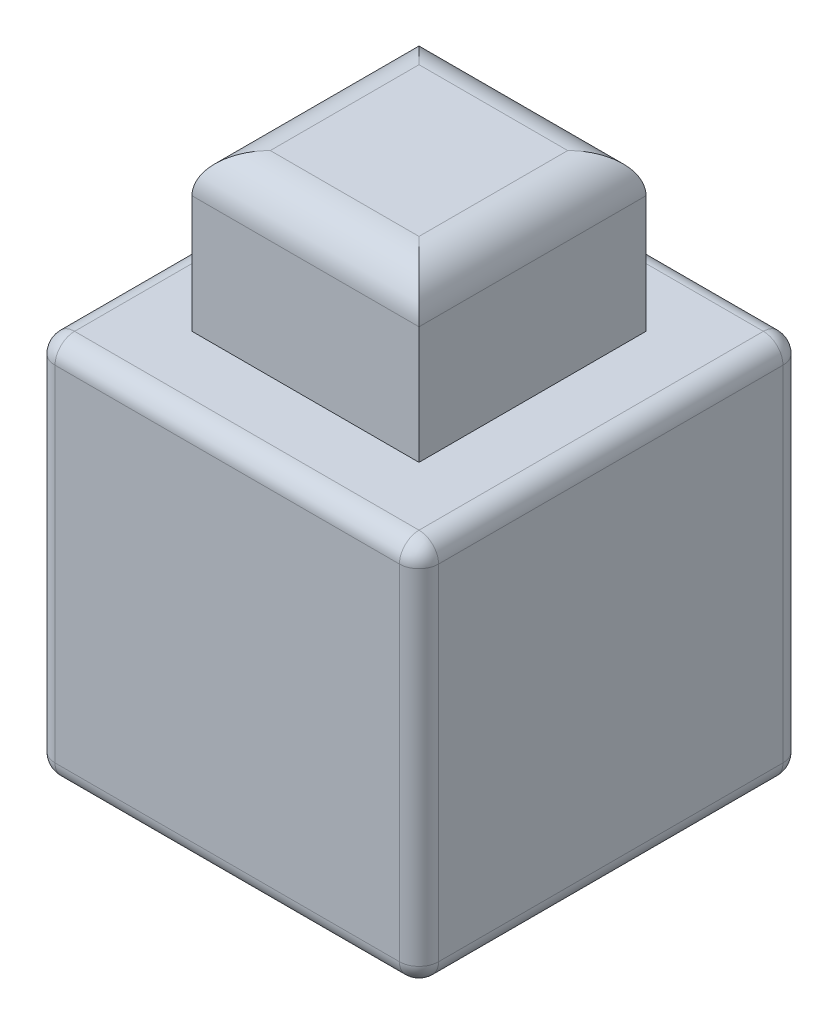
ISO-10303-21;
HEADER;
FILE_DESCRIPTION(('STEP AP214'),'2;1');
FILE_NAME('part.step','',(''),(''),'','','');
FILE_SCHEMA(('AUTOMOTIVE_DESIGN { 1 0 10303 214 1 1 1 1 }'));
ENDSEC;
DATA;
#1=APPLICATION_CONTEXT('core data for automotive mechanical design processes');
#2=APPLICATION_PROTOCOL_DEFINITION('international standard','automotive_design',2000,#1);
#3=PRODUCT_CONTEXT('',#1,'mechanical');
#4=PRODUCT('Part','Part','',(#3));
#5=PRODUCT_RELATED_PRODUCT_CATEGORY('part','',(#4));
#6=PRODUCT_DEFINITION_FORMATION('','',#4);
#7=PRODUCT_DEFINITION_CONTEXT('part definition',#1,'design');
#8=PRODUCT_DEFINITION('design','',#6,#7);
#9=PRODUCT_DEFINITION_SHAPE('','',#8);
#10=(LENGTH_UNIT() NAMED_UNIT(*) SI_UNIT(.MILLI.,.METRE.));
#11=(NAMED_UNIT(*) PLANE_ANGLE_UNIT() SI_UNIT($,.RADIAN.));
#12=(NAMED_UNIT(*) SI_UNIT($,.STERADIAN.) SOLID_ANGLE_UNIT());
#13=UNCERTAINTY_MEASURE_WITH_UNIT(LENGTH_MEASURE(1.E-05),#10,'distance_accuracy_value','');
#14=(GEOMETRIC_REPRESENTATION_CONTEXT(3) GLOBAL_UNCERTAINTY_ASSIGNED_CONTEXT((#13)) GLOBAL_UNIT_ASSIGNED_CONTEXT((#10,
#11,#12)) REPRESENTATION_CONTEXT('',''));
#15=CARTESIAN_POINT('',(0.,0.,0.));
#16=DIRECTION('',(0.,0.,1.));
#17=DIRECTION('',(1.,0.,0.));
#18=AXIS2_PLACEMENT_3D('',#15,#16,#17);
#19=CARTESIAN_POINT('',(4.9,4.9,-9.8));
#20=DIRECTION('',(1.,0.,0.));
#21=DIRECTION('',(0.,1.,0.));
#22=AXIS2_PLACEMENT_3D('',#19,#20,#21);
#23=PLANE('',#22);
#24=DIRECTION('',(0.,1.,0.));
#25=VECTOR('',#24,1.);
#26=CARTESIAN_POINT('',(4.9,4.9,-9.3));
#27=LINE('',#26,#25);
#28=CARTESIAN_POINT('',(4.9,-4.4,-9.3));
#29=VERTEX_POINT('',#28);
#30=CARTESIAN_POINT('',(4.9,4.4,-9.3));
#31=VERTEX_POINT('',#30);
#32=EDGE_CURVE('E290',#29,#31,#27,.T.);
#33=ORIENTED_EDGE('',*,*,#32,.T.);
#34=DIRECTION('',(0.,0.,1.));
#35=VECTOR('',#34,1.);
#36=CARTESIAN_POINT('',(4.9,4.4,-9.8));
#37=LINE('',#36,#35);
#38=CARTESIAN_POINT('',(4.9,4.4,-0.5));
#39=VERTEX_POINT('',#38);
#40=EDGE_CURVE('E293',#31,#39,#37,.T.);
#41=ORIENTED_EDGE('',*,*,#40,.T.);
#42=DIRECTION('',(0.,1.,0.));
#43=VECTOR('',#42,1.);
#44=CARTESIAN_POINT('',(4.9,4.9,-0.5));
#45=LINE('',#44,#43);
#46=CARTESIAN_POINT('',(4.9,-4.4,-0.5));
#47=VERTEX_POINT('',#46);
#48=EDGE_CURVE('E287',#39,#47,#45,.F.);
#49=ORIENTED_EDGE('',*,*,#48,.T.);
#50=DIRECTION('',(0.,0.,1.));
#51=VECTOR('',#50,1.);
#52=CARTESIAN_POINT('',(4.9,-4.4,-9.8));
#53=LINE('',#52,#51);
#54=EDGE_CURVE('E284',#47,#29,#53,.F.);
#55=ORIENTED_EDGE('',*,*,#54,.T.);
#56=EDGE_LOOP('',(#33,#41,#49,#55));
#57=FACE_BOUND('',#56,.T.);
#58=ADVANCED_FACE('F39',(#57),#23,.T.);
#59=CARTESIAN_POINT('',(-4.9,-4.9,-9.8));
#60=DIRECTION('',(0.,-1.,0.));
#61=DIRECTION('',(0.,0.,-1.));
#62=AXIS2_PLACEMENT_3D('',#59,#60,#61);
#63=PLANE('',#62);
#64=DIRECTION('',(1.,0.,0.));
#65=VECTOR('',#64,1.);
#66=CARTESIAN_POINT('',(4.9,-4.9,-9.3));
#67=LINE('',#66,#65);
#68=CARTESIAN_POINT('',(-4.4,-4.9,-9.3));
#69=VERTEX_POINT('',#68);
#70=CARTESIAN_POINT('',(4.4,-4.9,-9.3));
#71=VERTEX_POINT('',#70);
#72=EDGE_CURVE('E49',#69,#71,#67,.T.);
#73=ORIENTED_EDGE('',*,*,#72,.T.);
#74=DIRECTION('',(0.,0.,1.));
#75=VECTOR('',#74,1.);
#76=CARTESIAN_POINT('',(4.4,-4.9,-9.8));
#77=LINE('',#76,#75);
#78=CARTESIAN_POINT('',(4.4,-4.9,-0.5));
#79=VERTEX_POINT('',#78);
#80=EDGE_CURVE('E11',#71,#79,#77,.T.);
#81=ORIENTED_EDGE('',*,*,#80,.T.);
#82=DIRECTION('',(1.,0.,0.));
#83=VECTOR('',#82,1.);
#84=CARTESIAN_POINT('',(-4.9,-4.9,-0.5));
#85=LINE('',#84,#83);
#86=CARTESIAN_POINT('',(-4.4,-4.9,-0.5));
#87=VERTEX_POINT('',#86);
#88=EDGE_CURVE('E310',#79,#87,#85,.F.);
#89=ORIENTED_EDGE('',*,*,#88,.T.);
#90=DIRECTION('',(0.,0.,1.));
#91=VECTOR('',#90,1.);
#92=CARTESIAN_POINT('',(-4.4,-4.9,-9.8));
#93=LINE('',#92,#91);
#94=EDGE_CURVE('E60',#87,#69,#93,.F.);
#95=ORIENTED_EDGE('',*,*,#94,.T.);
#96=EDGE_LOOP('',(#73,#81,#89,#95));
#97=FACE_BOUND('',#96,.T.);
#98=ADVANCED_FACE('F445',(#97),#63,.T.);
#99=CARTESIAN_POINT('',(-4.9,4.9,-9.8));
#100=DIRECTION('',(-1.,0.,0.));
#101=DIRECTION('',(0.,0.,1.));
#102=AXIS2_PLACEMENT_3D('',#99,#100,#101);
#103=PLANE('',#102);
#104=DIRECTION('',(0.,-1.,0.));
#105=VECTOR('',#104,1.);
#106=CARTESIAN_POINT('',(-4.9,4.9,-0.5));
#107=LINE('',#106,#105);
#108=CARTESIAN_POINT('',(-4.9,-4.4,-0.5));
#109=VERTEX_POINT('',#108);
#110=CARTESIAN_POINT('',(-4.9,4.4,-0.5));
#111=VERTEX_POINT('',#110);
#112=EDGE_CURVE('E261',#109,#111,#107,.F.);
#113=ORIENTED_EDGE('',*,*,#112,.T.);
#114=DIRECTION('',(0.,0.,1.));
#115=VECTOR('',#114,1.);
#116=CARTESIAN_POINT('',(-4.9,4.4,-9.8));
#117=LINE('',#116,#115);
#118=CARTESIAN_POINT('',(-4.9,4.4,-9.3));
#119=VERTEX_POINT('',#118);
#120=EDGE_CURVE('E267',#111,#119,#117,.F.);
#121=ORIENTED_EDGE('',*,*,#120,.T.);
#122=DIRECTION('',(0.,-1.,0.));
#123=VECTOR('',#122,1.);
#124=CARTESIAN_POINT('',(-4.9,-4.9,-9.3));
#125=LINE('',#124,#123);
#126=CARTESIAN_POINT('',(-4.9,-4.4,-9.3));
#127=VERTEX_POINT('',#126);
#128=EDGE_CURVE('E264',#119,#127,#125,.T.);
#129=ORIENTED_EDGE('',*,*,#128,.T.);
#130=DIRECTION('',(0.,0.,1.));
#131=VECTOR('',#130,1.);
#132=CARTESIAN_POINT('',(-4.9,-4.4,-9.8));
#133=LINE('',#132,#131);
#134=EDGE_CURVE('E258',#127,#109,#133,.T.);
#135=ORIENTED_EDGE('',*,*,#134,.T.);
#136=EDGE_LOOP('',(#113,#121,#129,#135));
#137=FACE_BOUND('',#136,.T.);
#138=ADVANCED_FACE('F464',(#137),#103,.T.);
#139=CARTESIAN_POINT('',(-4.9,4.9,-9.8));
#140=DIRECTION('',(0.,1.,0.));
#141=DIRECTION('',(0.,0.,1.));
#142=AXIS2_PLACEMENT_3D('',#139,#140,#141);
#143=PLANE('',#142);
#144=DIRECTION('',(-1.,0.,0.));
#145=VECTOR('',#144,1.);
#146=CARTESIAN_POINT('',(-4.9,4.9,-9.3));
#147=LINE('',#146,#145);
#148=CARTESIAN_POINT('',(4.4,4.9,-9.3));
#149=VERTEX_POINT('',#148);
#150=CARTESIAN_POINT('',(-4.4,4.9,-9.3));
#151=VERTEX_POINT('',#150);
#152=EDGE_CURVE('E251',#149,#151,#147,.T.);
#153=ORIENTED_EDGE('',*,*,#152,.T.);
#154=DIRECTION('',(0.,0.,1.));
#155=VECTOR('',#154,1.);
#156=CARTESIAN_POINT('',(-4.4,4.9,-9.8));
#157=LINE('',#156,#155);
#158=CARTESIAN_POINT('',(-4.4,4.9,-0.5));
#159=VERTEX_POINT('',#158);
#160=EDGE_CURVE('E254',#151,#159,#157,.T.);
#161=ORIENTED_EDGE('',*,*,#160,.T.);
#162=DIRECTION('',(-1.,0.,0.));
#163=VECTOR('',#162,1.);
#164=CARTESIAN_POINT('',(-4.9,4.9,-0.5));
#165=LINE('',#164,#163);
#166=CARTESIAN_POINT('',(4.4,4.9,-0.5));
#167=VERTEX_POINT('',#166);
#168=EDGE_CURVE('E232',#159,#167,#165,.F.);
#169=ORIENTED_EDGE('',*,*,#168,.T.);
#170=DIRECTION('',(0.,0.,1.));
#171=VECTOR('',#170,1.);
#172=CARTESIAN_POINT('',(4.4,4.9,-9.8));
#173=LINE('',#172,#171);
#174=EDGE_CURVE('E248',#167,#149,#173,.F.);
#175=ORIENTED_EDGE('',*,*,#174,.T.);
#176=EDGE_LOOP('',(#153,#161,#169,#175));
#177=FACE_BOUND('',#176,.T.);
#178=DIRECTION('',(0.,0.,-1.));
#179=VECTOR('',#178,1.);
#180=CARTESIAN_POINT('',(2.9,4.9,-7.8));
#181=LINE('',#180,#179);
#182=CARTESIAN_POINT('',(2.9,4.9,-2.));
#183=VERTEX_POINT('',#182);
#184=CARTESIAN_POINT('',(2.9,4.9,-7.8));
#185=VERTEX_POINT('',#184);
#186=EDGE_CURVE('E193',#183,#185,#181,.T.);
#187=ORIENTED_EDGE('',*,*,#186,.F.);
#188=DIRECTION('',(1.,0.,0.));
#189=VECTOR('',#188,1.);
#190=CARTESIAN_POINT('',(-2.9,4.9,-2.));
#191=LINE('',#190,#189);
#192=CARTESIAN_POINT('',(-2.9,4.9,-2.));
#193=VERTEX_POINT('',#192);
#194=EDGE_CURVE('E187',#193,#183,#191,.T.);
#195=ORIENTED_EDGE('',*,*,#194,.F.);
#196=DIRECTION('',(0.,0.,1.));
#197=VECTOR('',#196,1.);
#198=CARTESIAN_POINT('',(-2.9,4.9,-7.8));
#199=LINE('',#198,#197);
#200=CARTESIAN_POINT('',(-2.9,4.9,-7.8));
#201=VERTEX_POINT('',#200);
#202=EDGE_CURVE('E168',#201,#193,#199,.T.);
#203=ORIENTED_EDGE('',*,*,#202,.F.);
#204=DIRECTION('',(-1.,0.,0.));
#205=VECTOR('',#204,1.);
#206=CARTESIAN_POINT('',(-2.9,4.9,-7.8));
#207=LINE('',#206,#205);
#208=EDGE_CURVE('E184',#185,#201,#207,.T.);
#209=ORIENTED_EDGE('',*,*,#208,.F.);
#210=EDGE_LOOP('',(#187,#195,#203,#209));
#211=FACE_BOUND('',#210,.T.);
#212=ADVANCED_FACE('F183',(#177,#211),#143,.T.);
#213=CARTESIAN_POINT('',(0.,0.,-9.8));
#214=DIRECTION('',(0.,0.,1.));
#215=DIRECTION('',(1.,0.,0.));
#216=AXIS2_PLACEMENT_3D('',#213,#214,#215);
#217=PLANE('',#216);
#218=DIRECTION('',(0.,-1.,0.));
#219=VECTOR('',#218,1.);
#220=CARTESIAN_POINT('',(-4.4,4.9,-9.8));
#221=LINE('',#220,#219);
#222=CARTESIAN_POINT('',(-4.4,-4.4,-9.8));
#223=VERTEX_POINT('',#222);
#224=CARTESIAN_POINT('',(-4.4,4.4,-9.8));
#225=VERTEX_POINT('',#224);
#226=EDGE_CURVE('E277',#223,#225,#221,.F.);
#227=ORIENTED_EDGE('',*,*,#226,.T.);
#228=DIRECTION('',(-1.,0.,0.));
#229=VECTOR('',#228,1.);
#230=CARTESIAN_POINT('',(4.9,4.4,-9.8));
#231=LINE('',#230,#229);
#232=CARTESIAN_POINT('',(4.4,4.4,-9.8));
#233=VERTEX_POINT('',#232);
#234=EDGE_CURVE('E280',#225,#233,#231,.F.);
#235=ORIENTED_EDGE('',*,*,#234,.T.);
#236=DIRECTION('',(0.,1.,0.));
#237=VECTOR('',#236,1.);
#238=CARTESIAN_POINT('',(4.4,-4.9,-9.8));
#239=LINE('',#238,#237);
#240=CARTESIAN_POINT('',(4.4,-4.4,-9.8));
#241=VERTEX_POINT('',#240);
#242=EDGE_CURVE('E274',#233,#241,#239,.F.);
#243=ORIENTED_EDGE('',*,*,#242,.T.);
#244=DIRECTION('',(1.,0.,0.));
#245=VECTOR('',#244,1.);
#246=CARTESIAN_POINT('',(-4.9,-4.4,-9.8));
#247=LINE('',#246,#245);
#248=EDGE_CURVE('E271',#241,#223,#247,.F.);
#249=ORIENTED_EDGE('',*,*,#248,.T.);
#250=EDGE_LOOP('',(#227,#235,#243,#249));
#251=FACE_BOUND('',#250,.T.);
#252=ADVANCED_FACE('F423',(#251),#217,.F.);
#253=CARTESIAN_POINT('',(0.,0.,0.));
#254=DIRECTION('',(0.,0.,1.));
#255=DIRECTION('',(1.,0.,0.));
#256=AXIS2_PLACEMENT_3D('',#253,#254,#255);
#257=PLANE('',#256);
#258=DIRECTION('',(-1.,0.,0.));
#259=VECTOR('',#258,1.);
#260=CARTESIAN_POINT('',(0.,4.4,0.));
#261=LINE('',#260,#259);
#262=CARTESIAN_POINT('',(4.4,4.4,0.));
#263=VERTEX_POINT('',#262);
#264=CARTESIAN_POINT('',(-4.4,4.4,0.));
#265=VERTEX_POINT('',#264);
#266=EDGE_CURVE('E303',#263,#265,#261,.T.);
#267=ORIENTED_EDGE('',*,*,#266,.T.);
#268=DIRECTION('',(0.,-1.,0.));
#269=VECTOR('',#268,1.);
#270=CARTESIAN_POINT('',(-4.4,0.,0.));
#271=LINE('',#270,#269);
#272=CARTESIAN_POINT('',(-4.4,-4.4,0.));
#273=VERTEX_POINT('',#272);
#274=EDGE_CURVE('E306',#265,#273,#271,.T.);
#275=ORIENTED_EDGE('',*,*,#274,.T.);
#276=DIRECTION('',(1.,0.,0.));
#277=VECTOR('',#276,1.);
#278=CARTESIAN_POINT('',(0.,-4.4,0.));
#279=LINE('',#278,#277);
#280=CARTESIAN_POINT('',(4.4,-4.4,0.));
#281=VERTEX_POINT('',#280);
#282=EDGE_CURVE('E297',#273,#281,#279,.T.);
#283=ORIENTED_EDGE('',*,*,#282,.T.);
#284=DIRECTION('',(0.,1.,0.));
#285=VECTOR('',#284,1.);
#286=CARTESIAN_POINT('',(4.4,0.,0.));
#287=LINE('',#286,#285);
#288=EDGE_CURVE('E300',#281,#263,#287,.T.);
#289=ORIENTED_EDGE('',*,*,#288,.T.);
#290=EDGE_LOOP('',(#267,#275,#283,#289));
#291=FACE_BOUND('',#290,.T.);
#292=ADVANCED_FACE('F721',(#291),#257,.T.);
#293=CARTESIAN_POINT('',(2.9,8.9,-7.8));
#294=DIRECTION('',(-1.,0.,0.));
#295=DIRECTION('',(0.,0.,1.));
#296=AXIS2_PLACEMENT_3D('',#293,#294,#295);
#297=PLANE('',#296);
#298=DIRECTION('',(0.,-1.,0.));
#299=VECTOR('',#298,1.);
#300=CARTESIAN_POINT('',(2.9,8.9,-7.8));
#301=LINE('',#300,#299);
#302=CARTESIAN_POINT('',(2.9,7.9,-7.8));
#303=VERTEX_POINT('',#302);
#304=EDGE_CURVE('E176',#303,#185,#301,.T.);
#305=ORIENTED_EDGE('',*,*,#304,.F.);
#306=DIRECTION('',(0.,0.,-1.));
#307=VECTOR('',#306,1.);
#308=CARTESIAN_POINT('',(2.9,7.9,-2.));
#309=LINE('',#308,#307);
#310=CARTESIAN_POINT('',(2.9,7.9,-2.));
#311=VERTEX_POINT('',#310);
#312=EDGE_CURVE('E229',#303,#311,#309,.F.);
#313=ORIENTED_EDGE('',*,*,#312,.T.);
#314=DIRECTION('',(0.,-1.,0.));
#315=VECTOR('',#314,1.);
#316=CARTESIAN_POINT('',(2.9,8.9,-2.));
#317=LINE('',#316,#315);
#318=EDGE_CURVE('E201',#311,#183,#317,.T.);
#319=ORIENTED_EDGE('',*,*,#318,.T.);
#320=ORIENTED_EDGE('',*,*,#186,.T.);
#321=EDGE_LOOP('',(#305,#313,#319,#320));
#322=FACE_BOUND('',#321,.T.);
#323=ADVANCED_FACE('F713',(#322),#297,.F.);
#324=CARTESIAN_POINT('',(-2.9,8.9,-7.8));
#325=DIRECTION('',(0.,0.,1.));
#326=DIRECTION('',(1.,0.,0.));
#327=AXIS2_PLACEMENT_3D('',#324,#325,#326);
#328=PLANE('',#327);
#329=DIRECTION('',(0.,-1.,0.));
#330=VECTOR('',#329,1.);
#331=CARTESIAN_POINT('',(-2.9,8.9,-7.8));
#332=LINE('',#331,#330);
#333=CARTESIAN_POINT('',(-2.9,7.9,-7.8));
#334=VERTEX_POINT('',#333);
#335=EDGE_CURVE('E164',#334,#201,#332,.T.);
#336=ORIENTED_EDGE('',*,*,#335,.F.);
#337=DIRECTION('',(-1.,0.,0.));
#338=VECTOR('',#337,1.);
#339=CARTESIAN_POINT('',(2.9,7.9,-7.8));
#340=LINE('',#339,#338);
#341=EDGE_CURVE('E221',#334,#303,#340,.F.);
#342=ORIENTED_EDGE('',*,*,#341,.T.);
#343=ORIENTED_EDGE('',*,*,#304,.T.);
#344=ORIENTED_EDGE('',*,*,#208,.T.);
#345=EDGE_LOOP('',(#336,#342,#343,#344));
#346=FACE_BOUND('',#345,.T.);
#347=ADVANCED_FACE('F190',(#346),#328,.F.);
#348=CARTESIAN_POINT('',(-2.9,8.9,-7.8));
#349=DIRECTION('',(1.,0.,0.));
#350=DIRECTION('',(0.,0.,-1.));
#351=AXIS2_PLACEMENT_3D('',#348,#349,#350);
#352=PLANE('',#351);
#353=DIRECTION('',(0.,-1.,0.));
#354=VECTOR('',#353,1.);
#355=CARTESIAN_POINT('',(-2.9,8.9,-2.));
#356=LINE('',#355,#354);
#357=CARTESIAN_POINT('',(-2.9,7.9,-2.));
#358=VERTEX_POINT('',#357);
#359=EDGE_CURVE('E177',#358,#193,#356,.T.);
#360=ORIENTED_EDGE('',*,*,#359,.F.);
#361=DIRECTION('',(0.,0.,1.));
#362=VECTOR('',#361,1.);
#363=CARTESIAN_POINT('',(-2.9,7.9,-7.8));
#364=LINE('',#363,#362);
#365=EDGE_CURVE('E170',#358,#334,#364,.F.);
#366=ORIENTED_EDGE('',*,*,#365,.T.);
#367=ORIENTED_EDGE('',*,*,#335,.T.);
#368=ORIENTED_EDGE('',*,*,#202,.T.);
#369=EDGE_LOOP('',(#360,#366,#367,#368));
#370=FACE_BOUND('',#369,.T.);
#371=ADVANCED_FACE('F167',(#370),#352,.F.);
#372=CARTESIAN_POINT('',(-2.9,8.9,-2.));
#373=DIRECTION('',(0.,0.,-1.));
#374=DIRECTION('',(-1.,0.,0.));
#375=AXIS2_PLACEMENT_3D('',#372,#373,#374);
#376=PLANE('',#375);
#377=ORIENTED_EDGE('',*,*,#318,.F.);
#378=DIRECTION('',(1.,0.,0.));
#379=VECTOR('',#378,1.);
#380=CARTESIAN_POINT('',(-2.9,7.9,-2.));
#381=LINE('',#380,#379);
#382=EDGE_CURVE('E226',#311,#358,#381,.F.);
#383=ORIENTED_EDGE('',*,*,#382,.T.);
#384=ORIENTED_EDGE('',*,*,#359,.T.);
#385=ORIENTED_EDGE('',*,*,#194,.T.);
#386=EDGE_LOOP('',(#377,#383,#384,#385));
#387=FACE_BOUND('',#386,.T.);
#388=ADVANCED_FACE('F689',(#387),#376,.F.);
#389=CARTESIAN_POINT('',(0.,8.9,0.));
#390=DIRECTION('',(0.,1.,0.));
#391=DIRECTION('',(0.,0.,1.));
#392=AXIS2_PLACEMENT_3D('',#389,#390,#391);
#393=PLANE('',#392);
#394=DIRECTION('',(0.,0.,-1.));
#395=VECTOR('',#394,1.);
#396=CARTESIAN_POINT('',(1.9,8.9,-7.8));
#397=LINE('',#396,#395);
#398=CARTESIAN_POINT('',(1.9,8.9,-3.));
#399=VERTEX_POINT('',#398);
#400=CARTESIAN_POINT('',(1.9,8.9,-6.8));
#401=VERTEX_POINT('',#400);
#402=EDGE_CURVE('E208',#399,#401,#397,.T.);
#403=ORIENTED_EDGE('',*,*,#402,.T.);
#404=DIRECTION('',(-1.,0.,0.));
#405=VECTOR('',#404,1.);
#406=CARTESIAN_POINT('',(-2.9,8.9,-6.8));
#407=LINE('',#406,#405);
#408=CARTESIAN_POINT('',(-1.9,8.9,-6.8));
#409=VERTEX_POINT('',#408);
#410=EDGE_CURVE('E217',#401,#409,#407,.T.);
#411=ORIENTED_EDGE('',*,*,#410,.T.);
#412=DIRECTION('',(0.,0.,1.));
#413=VECTOR('',#412,1.);
#414=CARTESIAN_POINT('',(-1.9,8.9,-2.));
#415=LINE('',#414,#413);
#416=CARTESIAN_POINT('',(-1.9,8.9,-3.));
#417=VERTEX_POINT('',#416);
#418=EDGE_CURVE('E214',#409,#417,#415,.T.);
#419=ORIENTED_EDGE('',*,*,#418,.T.);
#420=DIRECTION('',(1.,0.,0.));
#421=VECTOR('',#420,1.);
#422=CARTESIAN_POINT('',(2.9,8.9,-3.));
#423=LINE('',#422,#421);
#424=EDGE_CURVE('E211',#417,#399,#423,.T.);
#425=ORIENTED_EDGE('',*,*,#424,.T.);
#426=EDGE_LOOP('',(#403,#411,#419,#425));
#427=FACE_BOUND('',#426,.T.);
#428=ADVANCED_FACE('F514',(#427),#393,.T.);
#429=CARTESIAN_POINT('',(0.,7.9,-3.));
#430=DIRECTION('',(-1.,0.,0.));
#431=DIRECTION('',(0.,0.,1.));
#432=AXIS2_PLACEMENT_3D('',#429,#430,#431);
#433=CYLINDRICAL_SURFACE('',#432,1.);
#434=CARTESIAN_POINT('',(-1.9,7.9,-3.));
#435=DIRECTION('',(-0.707106781186548,0.,-0.707106781186547));
#436=DIRECTION('',(-0.707106781186547,0.,0.707106781186548));
#437=AXIS2_PLACEMENT_3D('',#434,#435,#436);
#438=ELLIPSE('',#437,1.41421356237309,1.);
#439=EDGE_CURVE('E239',#358,#417,#438,.T.);
#440=ORIENTED_EDGE('',*,*,#439,.F.);
#441=ORIENTED_EDGE('',*,*,#382,.F.);
#442=CARTESIAN_POINT('',(1.9,7.9,-3.));
#443=DIRECTION('',(-0.707106781186547,0.,0.707106781186548));
#444=DIRECTION('',(0.707106781186548,0.,0.707106781186547));
#445=AXIS2_PLACEMENT_3D('',#442,#443,#444);
#446=ELLIPSE('',#445,1.41421356237309,1.);
#447=EDGE_CURVE('E196',#399,#311,#446,.F.);
#448=ORIENTED_EDGE('',*,*,#447,.F.);
#449=ORIENTED_EDGE('',*,*,#424,.F.);
#450=EDGE_LOOP('',(#440,#441,#448,#449));
#451=FACE_BOUND('',#450,.T.);
#452=ADVANCED_FACE('F510',(#451),#433,.T.);
#453=CARTESIAN_POINT('',(1.9,7.9,0.));
#454=DIRECTION('',(0.,0.,1.));
#455=DIRECTION('',(1.,0.,0.));
#456=AXIS2_PLACEMENT_3D('',#453,#454,#455);
#457=CYLINDRICAL_SURFACE('',#456,1.);
#458=ORIENTED_EDGE('',*,*,#447,.T.);
#459=ORIENTED_EDGE('',*,*,#312,.F.);
#460=CARTESIAN_POINT('',(1.9,7.9,-6.8));
#461=DIRECTION('',(0.707106781186548,0.,0.707106781186547));
#462=DIRECTION('',(-0.707106781186547,0.,0.707106781186548));
#463=AXIS2_PLACEMENT_3D('',#460,#461,#462);
#464=ELLIPSE('',#463,1.41421356237309,1.);
#465=EDGE_CURVE('E236',#401,#303,#464,.F.);
#466=ORIENTED_EDGE('',*,*,#465,.F.);
#467=ORIENTED_EDGE('',*,*,#402,.F.);
#468=EDGE_LOOP('',(#458,#459,#466,#467));
#469=FACE_BOUND('',#468,.T.);
#470=ADVANCED_FACE('F506',(#469),#457,.T.);
#471=CARTESIAN_POINT('',(-1.9,7.9,0.));
#472=DIRECTION('',(0.,0.,-1.));
#473=DIRECTION('',(-1.,0.,0.));
#474=AXIS2_PLACEMENT_3D('',#471,#472,#473);
#475=CYLINDRICAL_SURFACE('',#474,1.);
#476=ORIENTED_EDGE('',*,*,#439,.T.);
#477=ORIENTED_EDGE('',*,*,#418,.F.);
#478=CARTESIAN_POINT('',(-1.9,7.9,-6.8));
#479=DIRECTION('',(0.707106781186547,0.,-0.707106781186548));
#480=DIRECTION('',(-0.707106781186548,0.,-0.707106781186547));
#481=AXIS2_PLACEMENT_3D('',#478,#479,#480);
#482=ELLIPSE('',#481,1.4142135623731,1.);
#483=EDGE_CURVE('E233',#334,#409,#482,.T.);
#484=ORIENTED_EDGE('',*,*,#483,.F.);
#485=ORIENTED_EDGE('',*,*,#365,.F.);
#486=EDGE_LOOP('',(#476,#477,#484,#485));
#487=FACE_BOUND('',#486,.T.);
#488=ADVANCED_FACE('F502',(#487),#475,.T.);
#489=CARTESIAN_POINT('',(0.,7.9,-6.8));
#490=DIRECTION('',(1.,0.,0.));
#491=DIRECTION('',(0.,0.,-1.));
#492=AXIS2_PLACEMENT_3D('',#489,#490,#491);
#493=CYLINDRICAL_SURFACE('',#492,1.);
#494=ORIENTED_EDGE('',*,*,#465,.T.);
#495=ORIENTED_EDGE('',*,*,#341,.F.);
#496=ORIENTED_EDGE('',*,*,#483,.T.);
#497=ORIENTED_EDGE('',*,*,#410,.F.);
#498=EDGE_LOOP('',(#494,#495,#496,#497));
#499=FACE_BOUND('',#498,.T.);
#500=ADVANCED_FACE('F499',(#499),#493,.T.);
#501=CARTESIAN_POINT('',(4.4,-4.4,-9.8));
#502=DIRECTION('',(0.,0.,1.));
#503=DIRECTION('',(1.,0.,0.));
#504=AXIS2_PLACEMENT_3D('',#501,#502,#503);
#505=CYLINDRICAL_SURFACE('',#504,0.5);
#506=CARTESIAN_POINT('',(4.4,-4.4,-9.3));
#507=DIRECTION('',(0.,0.,-1.));
#508=DIRECTION('',(-1.,0.,0.));
#509=AXIS2_PLACEMENT_3D('',#506,#507,#508);
#510=CIRCLE('',#509,0.5);
#511=EDGE_CURVE('E43',#29,#71,#510,.T.);
#512=ORIENTED_EDGE('',*,*,#511,.F.);
#513=ORIENTED_EDGE('',*,*,#54,.F.);
#514=CARTESIAN_POINT('',(4.4,-4.4,-0.5));
#515=DIRECTION('',(0.,0.,1.));
#516=DIRECTION('',(1.,0.,0.));
#517=AXIS2_PLACEMENT_3D('',#514,#515,#516);
#518=CIRCLE('',#517,0.5);
#519=EDGE_CURVE('E399',#79,#47,#518,.T.);
#520=ORIENTED_EDGE('',*,*,#519,.F.);
#521=ORIENTED_EDGE('',*,*,#80,.F.);
#522=EDGE_LOOP('',(#512,#513,#520,#521));
#523=FACE_BOUND('',#522,.T.);
#524=ADVANCED_FACE('F41',(#523),#505,.T.);
#525=CARTESIAN_POINT('',(4.4,-4.4,-9.3));
#526=DIRECTION('',(0.,-1.,0.));
#527=DIRECTION('',(0.,0.,-1.));
#528=AXIS2_PLACEMENT_3D('',#525,#526,#527);
#529=SPHERICAL_SURFACE('',#528,0.5);
#530=CARTESIAN_POINT('',(4.4,-4.4,-9.3));
#531=DIRECTION('',(0.,-1.,0.));
#532=DIRECTION('',(0.,0.,-1.));
#533=AXIS2_PLACEMENT_3D('',#530,#531,#532);
#534=CIRCLE('',#533,0.5);
#535=EDGE_CURVE('E392',#29,#241,#534,.F.);
#536=ORIENTED_EDGE('',*,*,#535,.F.);
#537=ORIENTED_EDGE('',*,*,#511,.T.);
#538=CARTESIAN_POINT('',(4.4,-4.4,-9.3));
#539=DIRECTION('',(1.,0.,0.));
#540=DIRECTION('',(0.,0.,-1.));
#541=AXIS2_PLACEMENT_3D('',#538,#539,#540);
#542=CIRCLE('',#541,0.5);
#543=EDGE_CURVE('E396',#241,#71,#542,.F.);
#544=ORIENTED_EDGE('',*,*,#543,.F.);
#545=EDGE_LOOP('',(#536,#537,#544));
#546=FACE_BOUND('',#545,.T.);
#547=ADVANCED_FACE('F412',(#546),#529,.T.);
#548=CARTESIAN_POINT('',(4.4,-4.4,-0.5));
#549=DIRECTION('',(1.,0.,0.));
#550=DIRECTION('',(0.,0.,-1.));
#551=AXIS2_PLACEMENT_3D('',#548,#549,#550);
#552=SPHERICAL_SURFACE('',#551,0.5);
#553=CARTESIAN_POINT('',(4.4,-4.4,-0.5));
#554=DIRECTION('',(1.,0.,0.));
#555=DIRECTION('',(0.,0.,-1.));
#556=AXIS2_PLACEMENT_3D('',#553,#554,#555);
#557=CIRCLE('',#556,0.5);
#558=EDGE_CURVE('E384',#79,#281,#557,.F.);
#559=ORIENTED_EDGE('',*,*,#558,.F.);
#560=ORIENTED_EDGE('',*,*,#519,.T.);
#561=CARTESIAN_POINT('',(4.4,-4.4,-0.5));
#562=DIRECTION('',(0.,-1.,0.));
#563=DIRECTION('',(0.,0.,-1.));
#564=AXIS2_PLACEMENT_3D('',#561,#562,#563);
#565=CIRCLE('',#564,0.5);
#566=EDGE_CURVE('E388',#281,#47,#565,.F.);
#567=ORIENTED_EDGE('',*,*,#566,.F.);
#568=EDGE_LOOP('',(#559,#560,#567));
#569=FACE_BOUND('',#568,.T.);
#570=ADVANCED_FACE('F641',(#569),#552,.T.);
#571=CARTESIAN_POINT('',(-4.9,-4.4,-9.3));
#572=DIRECTION('',(-1.,0.,0.));
#573=DIRECTION('',(0.,0.,1.));
#574=AXIS2_PLACEMENT_3D('',#571,#572,#573);
#575=CYLINDRICAL_SURFACE('',#574,0.5);
#576=ORIENTED_EDGE('',*,*,#543,.T.);
#577=ORIENTED_EDGE('',*,*,#72,.F.);
#578=CARTESIAN_POINT('',(-4.4,-4.4,-9.3));
#579=DIRECTION('',(-1.,0.,0.));
#580=DIRECTION('',(0.,0.,1.));
#581=AXIS2_PLACEMENT_3D('',#578,#579,#580);
#582=CIRCLE('',#581,0.5);
#583=EDGE_CURVE('E376',#223,#69,#582,.T.);
#584=ORIENTED_EDGE('',*,*,#583,.F.);
#585=ORIENTED_EDGE('',*,*,#248,.F.);
#586=EDGE_LOOP('',(#576,#577,#584,#585));
#587=FACE_BOUND('',#586,.T.);
#588=ADVANCED_FACE('F418',(#587),#575,.T.);
#589=CARTESIAN_POINT('',(4.4,4.9,-9.3));
#590=DIRECTION('',(0.,-1.,0.));
#591=DIRECTION('',(1.,0.,0.));
#592=AXIS2_PLACEMENT_3D('',#589,#590,#591);
#593=CYLINDRICAL_SURFACE('',#592,0.5);
#594=ORIENTED_EDGE('',*,*,#535,.T.);
#595=ORIENTED_EDGE('',*,*,#242,.F.);
#596=CARTESIAN_POINT('',(4.4,4.4,-9.3));
#597=DIRECTION('',(0.,1.,0.));
#598=DIRECTION('',(0.,0.,1.));
#599=AXIS2_PLACEMENT_3D('',#596,#597,#598);
#600=CIRCLE('',#599,0.5);
#601=EDGE_CURVE('E372',#31,#233,#600,.T.);
#602=ORIENTED_EDGE('',*,*,#601,.F.);
#603=ORIENTED_EDGE('',*,*,#32,.F.);
#604=EDGE_LOOP('',(#594,#595,#602,#603));
#605=FACE_BOUND('',#604,.T.);
#606=ADVANCED_FACE('F429',(#605),#593,.T.);
#607=CARTESIAN_POINT('',(4.4,4.4,-9.8));
#608=DIRECTION('',(0.,0.,1.));
#609=DIRECTION('',(1.,0.,0.));
#610=AXIS2_PLACEMENT_3D('',#607,#608,#609);
#611=CYLINDRICAL_SURFACE('',#610,0.5);
#612=CARTESIAN_POINT('',(4.4,4.4,-0.5));
#613=DIRECTION('',(0.,0.,1.));
#614=DIRECTION('',(1.,0.,0.));
#615=AXIS2_PLACEMENT_3D('',#612,#613,#614);
#616=CIRCLE('',#615,0.5);
#617=EDGE_CURVE('E364',#39,#167,#616,.T.);
#618=ORIENTED_EDGE('',*,*,#617,.F.);
#619=ORIENTED_EDGE('',*,*,#40,.F.);
#620=CARTESIAN_POINT('',(4.4,4.4,-9.3));
#621=DIRECTION('',(0.,0.,-1.));
#622=DIRECTION('',(-1.,0.,0.));
#623=AXIS2_PLACEMENT_3D('',#620,#621,#622);
#624=CIRCLE('',#623,0.5);
#625=EDGE_CURVE('E368',#149,#31,#624,.T.);
#626=ORIENTED_EDGE('',*,*,#625,.F.);
#627=ORIENTED_EDGE('',*,*,#174,.F.);
#628=EDGE_LOOP('',(#618,#619,#626,#627));
#629=FACE_BOUND('',#628,.T.);
#630=ADVANCED_FACE('F435',(#629),#611,.T.);
#631=CARTESIAN_POINT('',(4.4,0.,-0.5));
#632=DIRECTION('',(0.,1.,0.));
#633=DIRECTION('',(-1.,0.,0.));
#634=AXIS2_PLACEMENT_3D('',#631,#632,#633);
#635=CYLINDRICAL_SURFACE('',#634,0.5);
#636=ORIENTED_EDGE('',*,*,#566,.T.);
#637=ORIENTED_EDGE('',*,*,#48,.F.);
#638=CARTESIAN_POINT('',(4.4,4.4,-0.5));
#639=DIRECTION('',(0.,1.,0.));
#640=DIRECTION('',(0.,0.,1.));
#641=AXIS2_PLACEMENT_3D('',#638,#639,#640);
#642=CIRCLE('',#641,0.5);
#643=EDGE_CURVE('E361',#263,#39,#642,.T.);
#644=ORIENTED_EDGE('',*,*,#643,.F.);
#645=ORIENTED_EDGE('',*,*,#288,.F.);
#646=EDGE_LOOP('',(#636,#637,#644,#645));
#647=FACE_BOUND('',#646,.T.);
#648=ADVANCED_FACE('F443',(#647),#635,.T.);
#649=CARTESIAN_POINT('',(0.,-4.4,-0.5));
#650=DIRECTION('',(1.,0.,0.));
#651=DIRECTION('',(0.,0.,-1.));
#652=AXIS2_PLACEMENT_3D('',#649,#650,#651);
#653=CYLINDRICAL_SURFACE('',#652,0.5);
#654=ORIENTED_EDGE('',*,*,#558,.T.);
#655=ORIENTED_EDGE('',*,*,#282,.F.);
#656=CARTESIAN_POINT('',(-4.4,-4.4,-0.5));
#657=DIRECTION('',(-1.,0.,0.));
#658=DIRECTION('',(0.,0.,1.));
#659=AXIS2_PLACEMENT_3D('',#656,#657,#658);
#660=CIRCLE('',#659,0.5);
#661=EDGE_CURVE('E357',#87,#273,#660,.T.);
#662=ORIENTED_EDGE('',*,*,#661,.F.);
#663=ORIENTED_EDGE('',*,*,#88,.F.);
#664=EDGE_LOOP('',(#654,#655,#662,#663));
#665=FACE_BOUND('',#664,.T.);
#666=ADVANCED_FACE('F454',(#665),#653,.T.);
#667=CARTESIAN_POINT('',(-4.4,-4.4,-9.8));
#668=DIRECTION('',(0.,0.,1.));
#669=DIRECTION('',(1.,0.,0.));
#670=AXIS2_PLACEMENT_3D('',#667,#668,#669);
#671=CYLINDRICAL_SURFACE('',#670,0.5);
#672=CARTESIAN_POINT('',(-4.4,-4.4,-9.3));
#673=DIRECTION('',(0.,0.,-1.));
#674=DIRECTION('',(-1.,0.,0.));
#675=AXIS2_PLACEMENT_3D('',#672,#673,#674);
#676=CIRCLE('',#675,0.5);
#677=EDGE_CURVE('E380',#69,#127,#676,.T.);
#678=ORIENTED_EDGE('',*,*,#677,.F.);
#679=ORIENTED_EDGE('',*,*,#94,.F.);
#680=CARTESIAN_POINT('',(-4.4,-4.4,-0.5));
#681=DIRECTION('',(0.,0.,1.));
#682=DIRECTION('',(1.,0.,0.));
#683=AXIS2_PLACEMENT_3D('',#680,#681,#682);
#684=CIRCLE('',#683,0.5);
#685=EDGE_CURVE('E353',#109,#87,#684,.T.);
#686=ORIENTED_EDGE('',*,*,#685,.F.);
#687=ORIENTED_EDGE('',*,*,#134,.F.);
#688=EDGE_LOOP('',(#678,#679,#686,#687));
#689=FACE_BOUND('',#688,.T.);
#690=ADVANCED_FACE('F450',(#689),#671,.T.);
#691=CARTESIAN_POINT('',(-4.4,-4.4,-9.3));
#692=DIRECTION('',(0.,-1.,0.));
#693=DIRECTION('',(0.,0.,-1.));
#694=AXIS2_PLACEMENT_3D('',#691,#692,#693);
#695=SPHERICAL_SURFACE('',#694,0.5);
#696=ORIENTED_EDGE('',*,*,#583,.T.);
#697=ORIENTED_EDGE('',*,*,#677,.T.);
#698=CARTESIAN_POINT('',(-4.4,-4.4,-9.3));
#699=DIRECTION('',(0.,-1.,0.));
#700=DIRECTION('',(0.,0.,-1.));
#701=AXIS2_PLACEMENT_3D('',#698,#699,#700);
#702=CIRCLE('',#701,0.5);
#703=EDGE_CURVE('E349',#223,#127,#702,.F.);
#704=ORIENTED_EDGE('',*,*,#703,.F.);
#705=EDGE_LOOP('',(#696,#697,#704));
#706=FACE_BOUND('',#705,.T.);
#707=ADVANCED_FACE('F467',(#706),#695,.T.);
#708=CARTESIAN_POINT('',(4.4,4.4,-9.3));
#709=DIRECTION('',(1.,0.,0.));
#710=DIRECTION('',(0.,0.,-1.));
#711=AXIS2_PLACEMENT_3D('',#708,#709,#710);
#712=SPHERICAL_SURFACE('',#711,0.5);
#713=ORIENTED_EDGE('',*,*,#625,.T.);
#714=ORIENTED_EDGE('',*,*,#601,.T.);
#715=CARTESIAN_POINT('',(4.4,4.4,-9.3));
#716=DIRECTION('',(1.,0.,0.));
#717=DIRECTION('',(0.,0.,-1.));
#718=AXIS2_PLACEMENT_3D('',#715,#716,#717);
#719=CIRCLE('',#718,0.5);
#720=EDGE_CURVE('E346',#149,#233,#719,.F.);
#721=ORIENTED_EDGE('',*,*,#720,.F.);
#722=EDGE_LOOP('',(#713,#714,#721));
#723=FACE_BOUND('',#722,.T.);
#724=ADVANCED_FACE('F480',(#723),#712,.T.);
#725=CARTESIAN_POINT('',(4.4,4.4,-0.5));
#726=DIRECTION('',(1.,0.,0.));
#727=DIRECTION('',(0.,0.,-1.));
#728=AXIS2_PLACEMENT_3D('',#725,#726,#727);
#729=SPHERICAL_SURFACE('',#728,0.5);
#730=ORIENTED_EDGE('',*,*,#643,.T.);
#731=ORIENTED_EDGE('',*,*,#617,.T.);
#732=CARTESIAN_POINT('',(4.4,4.4,-0.5));
#733=DIRECTION('',(1.,0.,0.));
#734=DIRECTION('',(0.,0.,-1.));
#735=AXIS2_PLACEMENT_3D('',#732,#733,#734);
#736=CIRCLE('',#735,0.5);
#737=EDGE_CURVE('E342',#263,#167,#736,.F.);
#738=ORIENTED_EDGE('',*,*,#737,.F.);
#739=EDGE_LOOP('',(#730,#731,#738));
#740=FACE_BOUND('',#739,.T.);
#741=ADVANCED_FACE('F482',(#740),#729,.T.);
#742=CARTESIAN_POINT('',(-4.4,-4.4,-0.5));
#743=DIRECTION('',(0.,-1.,0.));
#744=DIRECTION('',(0.,0.,-1.));
#745=AXIS2_PLACEMENT_3D('',#742,#743,#744);
#746=SPHERICAL_SURFACE('',#745,0.5);
#747=ORIENTED_EDGE('',*,*,#685,.T.);
#748=ORIENTED_EDGE('',*,*,#661,.T.);
#749=CARTESIAN_POINT('',(-4.4,-4.4,-0.5));
#750=DIRECTION('',(0.,-1.,0.));
#751=DIRECTION('',(1.,0.,0.));
#752=AXIS2_PLACEMENT_3D('',#749,#750,#751);
#753=CIRCLE('',#752,0.5);
#754=EDGE_CURVE('E339',#109,#273,#753,.F.);
#755=ORIENTED_EDGE('',*,*,#754,.F.);
#756=EDGE_LOOP('',(#747,#748,#755));
#757=FACE_BOUND('',#756,.T.);
#758=ADVANCED_FACE('F456',(#757),#746,.T.);
#759=CARTESIAN_POINT('',(-4.4,4.9,-9.3));
#760=DIRECTION('',(0.,1.,0.));
#761=DIRECTION('',(0.,0.,1.));
#762=AXIS2_PLACEMENT_3D('',#759,#760,#761);
#763=CYLINDRICAL_SURFACE('',#762,0.5);
#764=ORIENTED_EDGE('',*,*,#703,.T.);
#765=ORIENTED_EDGE('',*,*,#128,.F.);
#766=CARTESIAN_POINT('',(-4.4,4.4,-9.3));
#767=DIRECTION('',(0.,1.,0.));
#768=DIRECTION('',(0.,0.,1.));
#769=AXIS2_PLACEMENT_3D('',#766,#767,#768);
#770=CIRCLE('',#769,0.5);
#771=EDGE_CURVE('E335',#225,#119,#770,.T.);
#772=ORIENTED_EDGE('',*,*,#771,.F.);
#773=ORIENTED_EDGE('',*,*,#226,.F.);
#774=EDGE_LOOP('',(#764,#765,#772,#773));
#775=FACE_BOUND('',#774,.T.);
#776=ADVANCED_FACE('F469',(#775),#763,.T.);
#777=CARTESIAN_POINT('',(-4.9,4.4,-9.3));
#778=DIRECTION('',(1.,0.,0.));
#779=DIRECTION('',(0.,0.,-1.));
#780=AXIS2_PLACEMENT_3D('',#777,#778,#779);
#781=CYLINDRICAL_SURFACE('',#780,0.5);
#782=ORIENTED_EDGE('',*,*,#720,.T.);
#783=ORIENTED_EDGE('',*,*,#234,.F.);
#784=CARTESIAN_POINT('',(-4.4,4.4,-9.3));
#785=DIRECTION('',(-1.,0.,0.));
#786=DIRECTION('',(0.,0.,1.));
#787=AXIS2_PLACEMENT_3D('',#784,#785,#786);
#788=CIRCLE('',#787,0.5);
#789=EDGE_CURVE('E331',#151,#225,#788,.T.);
#790=ORIENTED_EDGE('',*,*,#789,.F.);
#791=ORIENTED_EDGE('',*,*,#152,.F.);
#792=EDGE_LOOP('',(#782,#783,#790,#791));
#793=FACE_BOUND('',#792,.T.);
#794=ADVANCED_FACE('F478',(#793),#781,.T.);
#795=CARTESIAN_POINT('',(0.,4.4,-0.5));
#796=DIRECTION('',(-1.,0.,0.));
#797=DIRECTION('',(0.,0.,1.));
#798=AXIS2_PLACEMENT_3D('',#795,#796,#797);
#799=CYLINDRICAL_SURFACE('',#798,0.5);
#800=ORIENTED_EDGE('',*,*,#737,.T.);
#801=ORIENTED_EDGE('',*,*,#168,.F.);
#802=CARTESIAN_POINT('',(-4.4,4.4,-0.5));
#803=DIRECTION('',(-1.,0.,0.));
#804=DIRECTION('',(0.,0.,1.));
#805=AXIS2_PLACEMENT_3D('',#802,#803,#804);
#806=CIRCLE('',#805,0.5);
#807=EDGE_CURVE('E327',#265,#159,#806,.T.);
#808=ORIENTED_EDGE('',*,*,#807,.F.);
#809=ORIENTED_EDGE('',*,*,#266,.F.);
#810=EDGE_LOOP('',(#800,#801,#808,#809));
#811=FACE_BOUND('',#810,.T.);
#812=ADVANCED_FACE('F528',(#811),#799,.T.);
#813=CARTESIAN_POINT('',(-4.4,0.,-0.5));
#814=DIRECTION('',(0.,-1.,0.));
#815=DIRECTION('',(0.,0.,-1.));
#816=AXIS2_PLACEMENT_3D('',#813,#814,#815);
#817=CYLINDRICAL_SURFACE('',#816,0.5);
#818=ORIENTED_EDGE('',*,*,#754,.T.);
#819=ORIENTED_EDGE('',*,*,#274,.F.);
#820=CARTESIAN_POINT('',(-4.4,4.4,-0.5));
#821=DIRECTION('',(0.,1.,0.));
#822=DIRECTION('',(0.,0.,1.));
#823=AXIS2_PLACEMENT_3D('',#820,#821,#822);
#824=CIRCLE('',#823,0.5);
#825=EDGE_CURVE('E323',#111,#265,#824,.T.);
#826=ORIENTED_EDGE('',*,*,#825,.F.);
#827=ORIENTED_EDGE('',*,*,#112,.F.);
#828=EDGE_LOOP('',(#818,#819,#826,#827));
#829=FACE_BOUND('',#828,.T.);
#830=ADVANCED_FACE('F461',(#829),#817,.T.);
#831=CARTESIAN_POINT('',(-4.4,4.4,-9.3));
#832=DIRECTION('',(0.,0.,-1.));
#833=DIRECTION('',(-1.,0.,0.));
#834=AXIS2_PLACEMENT_3D('',#831,#832,#833);
#835=SPHERICAL_SURFACE('',#834,0.5);
#836=ORIENTED_EDGE('',*,*,#789,.T.);
#837=ORIENTED_EDGE('',*,*,#771,.T.);
#838=CARTESIAN_POINT('',(-4.4,4.4,-9.3));
#839=DIRECTION('',(0.,0.,-1.));
#840=DIRECTION('',(-1.,0.,0.));
#841=AXIS2_PLACEMENT_3D('',#838,#839,#840);
#842=CIRCLE('',#841,0.5);
#843=EDGE_CURVE('E320',#151,#119,#842,.F.);
#844=ORIENTED_EDGE('',*,*,#843,.F.);
#845=EDGE_LOOP('',(#836,#837,#844));
#846=FACE_BOUND('',#845,.T.);
#847=ADVANCED_FACE('F474',(#846),#835,.T.);
#848=CARTESIAN_POINT('',(-4.4,4.4,-0.5));
#849=DIRECTION('',(0.,0.,1.));
#850=DIRECTION('',(1.,0.,0.));
#851=AXIS2_PLACEMENT_3D('',#848,#849,#850);
#852=SPHERICAL_SURFACE('',#851,0.5);
#853=ORIENTED_EDGE('',*,*,#825,.T.);
#854=ORIENTED_EDGE('',*,*,#807,.T.);
#855=CARTESIAN_POINT('',(-4.4,4.4,-0.5));
#856=DIRECTION('',(0.,0.,1.));
#857=DIRECTION('',(1.,0.,0.));
#858=AXIS2_PLACEMENT_3D('',#855,#856,#857);
#859=CIRCLE('',#858,0.5);
#860=EDGE_CURVE('E317',#111,#159,#859,.F.);
#861=ORIENTED_EDGE('',*,*,#860,.F.);
#862=EDGE_LOOP('',(#853,#854,#861));
#863=FACE_BOUND('',#862,.T.);
#864=ADVANCED_FACE('F519',(#863),#852,.T.);
#865=CARTESIAN_POINT('',(-4.4,4.4,-9.8));
#866=DIRECTION('',(0.,0.,1.));
#867=DIRECTION('',(1.,0.,0.));
#868=AXIS2_PLACEMENT_3D('',#865,#866,#867);
#869=CYLINDRICAL_SURFACE('',#868,0.5);
#870=ORIENTED_EDGE('',*,*,#843,.T.);
#871=ORIENTED_EDGE('',*,*,#120,.F.);
#872=ORIENTED_EDGE('',*,*,#860,.T.);
#873=ORIENTED_EDGE('',*,*,#160,.F.);
#874=EDGE_LOOP('',(#870,#871,#872,#873));
#875=FACE_BOUND('',#874,.T.);
#876=ADVANCED_FACE('F516',(#875),#869,.T.);
#877=CLOSED_SHELL('',(#58,#98,#138,#212,#252,#292,#323,#347,#371,#388,#428,#452,#470,#488,#500,
#524,#547,#570,#588,#606,#630,#648,#666,#690,#707,#724,#741,#758,#776,#794,#812,#830,#847,#864,#876));
#878=MANIFOLD_SOLID_BREP('B2',#877);
#879=ADVANCED_BREP_SHAPE_REPRESENTATION('',(#18,#878),#14);
#880=SHAPE_DEFINITION_REPRESENTATION(#9,#879);
ENDSEC;
END-ISO-10303-21;
